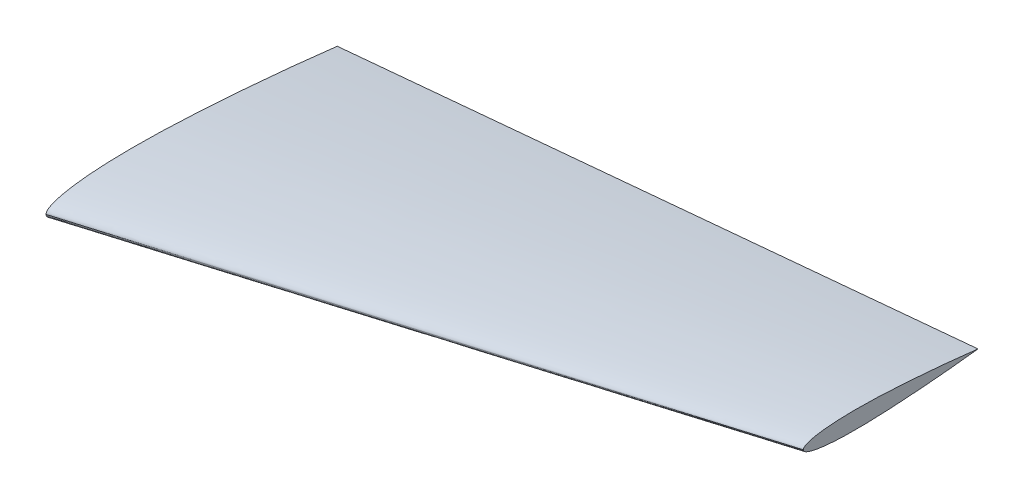
ISO-10303-21;
HEADER;
FILE_DESCRIPTION(('STEP AP214'),'2;1');
FILE_NAME('part.step','',(''),(''),'','','');
FILE_SCHEMA(('AUTOMOTIVE_DESIGN { 1 0 10303 214 1 1 1 1 }'));
ENDSEC;
DATA;
#1=APPLICATION_CONTEXT('core data for automotive mechanical design processes');
#2=APPLICATION_PROTOCOL_DEFINITION('international standard','automotive_design',2000,#1);
#3=PRODUCT_CONTEXT('',#1,'mechanical');
#4=PRODUCT('Part','Part','',(#3));
#5=PRODUCT_RELATED_PRODUCT_CATEGORY('part','',(#4));
#6=PRODUCT_DEFINITION_FORMATION('','',#4);
#7=PRODUCT_DEFINITION_CONTEXT('part definition',#1,'design');
#8=PRODUCT_DEFINITION('design','',#6,#7);
#9=PRODUCT_DEFINITION_SHAPE('','',#8);
#10=(LENGTH_UNIT() NAMED_UNIT(*) SI_UNIT(.MILLI.,.METRE.));
#11=(NAMED_UNIT(*) PLANE_ANGLE_UNIT() SI_UNIT($,.RADIAN.));
#12=(NAMED_UNIT(*) SI_UNIT($,.STERADIAN.) SOLID_ANGLE_UNIT());
#13=UNCERTAINTY_MEASURE_WITH_UNIT(LENGTH_MEASURE(1.E-05),#10,'distance_accuracy_value','');
#14=(GEOMETRIC_REPRESENTATION_CONTEXT(3) GLOBAL_UNCERTAINTY_ASSIGNED_CONTEXT((#13)) GLOBAL_UNIT_ASSIGNED_CONTEXT((#10,
#11,#12)) REPRESENTATION_CONTEXT('',''));
#15=CARTESIAN_POINT('',(0.,0.,0.));
#16=DIRECTION('',(0.,0.,1.));
#17=DIRECTION('',(1.,0.,0.));
#18=AXIS2_PLACEMENT_3D('',#15,#16,#17);
#19=CARTESIAN_POINT('',(0.,-11.0805057677963,126.305662571114));
#20=DIRECTION('',(-1.,0.,0.));
#21=DIRECTION('',(0.,0.,1.));
#22=AXIS2_PLACEMENT_3D('',#19,#20,#21);
#23=PLANE('',#22);
#24=CARTESIAN_POINT('',(0.,8.76924671884693E-13,250.));
#25=CARTESIAN_POINT('',(0.,-0.195763360710238,249.999895280876));
#26=CARTESIAN_POINT('',(0.,-0.603923402419787,249.961151424184));
#27=CARTESIAN_POINT('',(0.,-1.26325094626055,249.759559230242));
#28=CARTESIAN_POINT('',(0.,-2.2398068388507,249.128153902913));
#29=CARTESIAN_POINT('',(0.,-3.17523586217572,248.109823795484));
#30=CARTESIAN_POINT('',(0.,-4.18277314387237,246.576102634747));
#31=CARTESIAN_POINT('',(0.,-5.36669262195682,244.127109162365));
#32=CARTESIAN_POINT('',(0.,-6.81792315426411,240.073872733774));
#33=CARTESIAN_POINT('',(0.,-8.61128849568587,232.840047675853));
#34=CARTESIAN_POINT('',(0.,-10.4496536831648,221.294467729933));
#35=CARTESIAN_POINT('',(0.,-11.8177527202205,205.807713109822));
#36=CARTESIAN_POINT('',(0.,-12.5325051627526,187.492264179643));
#37=CARTESIAN_POINT('',(0.,-12.5623701882674,167.615673922212));
#38=CARTESIAN_POINT('',(0.,-12.1041559417348,147.961305870469));
#39=CARTESIAN_POINT('',(0.,-11.2208810590144,127.983093334777));
#40=CARTESIAN_POINT('',(0.,-10.1073324644267,108.565528946223));
#41=CARTESIAN_POINT('',(0.,-8.64786506361105,88.2724954742038));
#42=CARTESIAN_POINT('',(0.,-7.16412641424022,69.4578073458035));
#43=CARTESIAN_POINT('',(0.,-5.20504048666648,48.2491656867162));
#44=CARTESIAN_POINT('',(0.,-3.5473740497267,31.0441428619004));
#45=CARTESIAN_POINT('',(0.,-1.55880708226586,13.2037628030498));
#46=CARTESIAN_POINT('',(0.,-0.541092362047665,4.46722280332121));
#47=CARTESIAN_POINT('',(0.,9.38157011842053E-13,3.00315328161105E-11));
#48=B_SPLINE_CURVE_WITH_KNOTS('',4,(#24,#25,#26,#27,#28,#29,#30,#31,#32,#33,#34,#35,#36,#37,#38,
#39,#40,#41,#42,#43,#44,#45,#46,#47),.UNSPECIFIED.,.F.,.F.,(5,1,1,1,1,1,1,1,1,1,1,1,1,1,1,1,1,1,
1,1,5),(0.,0.00279140045981441,0.00588271915769683,0.00973465740831716,0.0165224026835013,
0.022438150700394,0.0321580273460902,0.0486342403302747,0.0782486520746178,0.129036717083551,
0.19999701137119,0.270957306932518,0.341917602300949,0.412877898163758,0.483838194434969,
0.554798490760736,0.625758786967488,0.696719083017031,0.767679378971491,0.838639675154267,
0.909599972772417),.UNSPECIFIED.);
#49=CARTESIAN_POINT('',(0.,0.,250.));
#50=VERTEX_POINT('',#49);
#51=CARTESIAN_POINT('',(0.,2.85432870910853E-11,2.35391723989832E-10));
#52=VERTEX_POINT('',#51);
#53=EDGE_CURVE('E57',#50,#52,#48,.T.);
#54=ORIENTED_EDGE('',*,*,#53,.F.);
#55=CARTESIAN_POINT('',(0.,2.85432870910853E-11,2.35391723989832E-10));
#56=CARTESIAN_POINT('',(0.,0.541092362069751,4.46722280347181));
#57=CARTESIAN_POINT('',(0.,1.55880708228551,13.2037628031866));
#58=CARTESIAN_POINT('',(0.,3.54737404973561,31.0441428619501));
#59=CARTESIAN_POINT('',(0.,5.20504048667037,48.2491656867162));
#60=CARTESIAN_POINT('',(0.,7.1641264142438,69.4578073458035));
#61=CARTESIAN_POINT('',(0.,8.64786506361434,88.272495474204));
#62=CARTESIAN_POINT('',(0.,10.1073324644297,108.565528946224));
#63=CARTESIAN_POINT('',(0.,11.2208810590171,127.983093334777));
#64=CARTESIAN_POINT('',(0.,12.1041559417372,147.961305870469));
#65=CARTESIAN_POINT('',(0.,12.5623701882695,167.615673922212));
#66=CARTESIAN_POINT('',(0.,12.5325051627544,187.492264179643));
#67=CARTESIAN_POINT('',(0.,11.817752720222,205.807713109822));
#68=CARTESIAN_POINT('',(0.,10.4496536831661,221.294467729933));
#69=CARTESIAN_POINT('',(0.,8.61128849568701,232.840047675853));
#70=CARTESIAN_POINT('',(0.,6.81792315426514,240.073872733774));
#71=CARTESIAN_POINT('',(0.,5.36669262195778,244.127109162365));
#72=CARTESIAN_POINT('',(0.,4.1827731438733,246.576102634747));
#73=CARTESIAN_POINT('',(0.,3.17523586217662,248.109823795484));
#74=CARTESIAN_POINT('',(0.,2.23980683885159,249.128153902913));
#75=CARTESIAN_POINT('',(0.,1.26325094626144,249.759559230242));
#76=CARTESIAN_POINT('',(0.,0.603923402420665,249.961151424184));
#77=CARTESIAN_POINT('',(0.,0.195763360711115,249.999895280876));
#78=CARTESIAN_POINT('',(0.,0.,250.));
#79=B_SPLINE_CURVE_WITH_KNOTS('',4,(#55,#56,#57,#58,#59,#60,#61,#62,#63,#64,#65,#66,#67,#68,#69,
#70,#71,#72,#73,#74,#75,#76,#77,#78),.UNSPECIFIED.,.F.,.F.,(5,1,1,1,1,1,1,1,1,1,1,1,1,1,1,1,1,1,
1,1,5),(0.,0.0709602976181498,0.141920593800927,0.212880889755386,0.283841185804929,
0.354801482011681,0.425761778337449,0.496722074608659,0.567682370471468,0.638642665839899,
0.709602961401227,0.780563255688866,0.831351320697799,0.860965732442143,0.877441945426327,
0.887161822072023,0.893077570088916,0.8998653153641,0.90371725361472,0.906808572312603,
0.909599972772417),.UNSPECIFIED.);
#80=EDGE_CURVE('E11',#52,#50,#79,.T.);
#81=ORIENTED_EDGE('',*,*,#80,.F.);
#82=EDGE_LOOP('',(#54,#81));
#83=FACE_BOUND('',#82,.T.);
#84=ADVANCED_FACE('F47',(#83),#23,.T.);
#85=CARTESIAN_POINT('',(500.,-6.64830346065999,25.7833975426506));
#86=DIRECTION('',(-1.,0.,0.));
#87=DIRECTION('',(0.,0.,1.));
#88=AXIS2_PLACEMENT_3D('',#85,#86,#87);
#89=PLANE('',#88);
#90=CARTESIAN_POINT('',(500.,1.82902943502338E-11,99.999999999982));
#91=CARTESIAN_POINT('',(500.,-0.117458016408378,99.9999371685073));
#92=CARTESIAN_POINT('',(500.,-0.362354041434108,99.9766908544924));
#93=CARTESIAN_POINT('',(500.,-0.757950567738569,99.855735538127));
#94=CARTESIAN_POINT('',(500.,-1.34388410329266,99.4768923417298));
#95=CARTESIAN_POINT('',(500.,-1.90514151728767,98.8658942772726));
#96=CARTESIAN_POINT('',(500.,-2.50966388630566,97.9456615808301));
#97=CARTESIAN_POINT('',(500.,-3.22001557315633,96.4762654974011));
#98=CARTESIAN_POINT('',(500.,-4.0907538925407,94.0443236402463));
#99=CARTESIAN_POINT('',(500.,-5.16677309739376,89.7040286054937));
#100=CARTESIAN_POINT('',(500.,-6.26979220988112,82.7766806379419));
#101=CARTESIAN_POINT('',(500.,-7.09065163211451,73.4846278658752));
#102=CARTESIAN_POINT('',(500.,-7.51950309763377,62.4953585077676));
#103=CARTESIAN_POINT('',(500.,-7.5374221129427,50.5694043533092));
#104=CARTESIAN_POINT('',(500.,-7.26249356502313,38.7767835222635));
#105=CARTESIAN_POINT('',(500.,-6.73252863539087,26.7898560008479));
#106=CARTESIAN_POINT('',(500.,-6.06439947863829,15.139317367716));
#107=CARTESIAN_POINT('',(500.,-5.18871903814888,2.96349728450425));
#108=CARTESIAN_POINT('',(500.,-4.29847584852638,-8.32531559253594));
#109=CARTESIAN_POINT('',(500.,-3.12302429198214,-21.0505005879883));
#110=CARTESIAN_POINT('',(500.,-2.12842442981827,-31.3735142828778));
#111=CARTESIAN_POINT('',(500.,-0.935284249341771,-42.0777423181882));
#112=CARTESIAN_POINT('',(500.,-0.324655417210853,-47.3196663180253));
#113=CARTESIAN_POINT('',(500.,1.8308664052221E-11,-50.));
#114=B_SPLINE_CURVE_WITH_KNOTS('',4,(#90,#91,#92,#93,#94,#95,#96,#97,#98,#99,#100,#101,#102,
#103,#104,#105,#106,#107,#108,#109,#110,#111,#112,#113),.UNSPECIFIED.,.F.,.F.,(5,1,1,1,1,1,1,1,
1,1,1,1,1,1,1,1,1,1,1,1,5),(0.,0.00279140045981441,0.00588271915769683,0.00973465740831716,
0.0165224026835013,0.022438150700394,0.0321580273460902,0.0486342403302747,0.0782486520746178,
0.129036717083551,0.19999701137119,0.270957306932518,0.341917602300949,0.412877898163758,
0.483838194434969,0.554798490760736,0.625758786967488,0.696719083017031,0.767679378971491,
0.838639675154267,0.909599972772417),.UNSPECIFIED.);
#115=CARTESIAN_POINT('',(500.,1.82902943502338E-11,99.9999999998402));
#116=VERTEX_POINT('',#115);
#117=CARTESIAN_POINT('',(500.,3.79336092472801E-11,-49.9999999999978));
#118=VERTEX_POINT('',#117);
#119=EDGE_CURVE('E79',#116,#118,#114,.T.);
#120=ORIENTED_EDGE('',*,*,#119,.T.);
#121=CARTESIAN_POINT('',(500.,3.79336092472801E-11,-49.9999999999978));
#122=CARTESIAN_POINT('',(500.,0.324655417261916,-47.3196663180615));
#123=CARTESIAN_POINT('',(500.,0.935284249391138,-42.077742318234));
#124=CARTESIAN_POINT('',(500.,2.12842442986014,-31.3735142829848));
#125=CARTESIAN_POINT('',(500.,3.12302429202051,-21.0505005881301));
#126=CARTESIAN_POINT('',(500.,4.29847584856457,-8.32531559267771));
#127=CARTESIAN_POINT('',(500.,5.1887190381869,2.96349728436258));
#128=CARTESIAN_POINT('',(500.,6.06439947867613,15.1393173675744));
#129=CARTESIAN_POINT('',(500.,6.73252863542854,26.7898560007062));
#130=CARTESIAN_POINT('',(500.,7.26249356506061,38.7767835221218));
#131=CARTESIAN_POINT('',(500.,7.53742211298001,50.5694043531676));
#132=CARTESIAN_POINT('',(500.,7.51950309767091,62.495358507626));
#133=CARTESIAN_POINT('',(500.,7.09065163215149,73.4846278657336));
#134=CARTESIAN_POINT('',(500.,6.26979220991796,82.7766806378002));
#135=CARTESIAN_POINT('',(500.,5.16677309743049,89.7040286053519));
#136=CARTESIAN_POINT('',(500.,4.09075389257737,94.0443236401045));
#137=CARTESIAN_POINT('',(500.,3.22001557319296,96.4762654972593));
#138=CARTESIAN_POINT('',(500.,2.50966388634227,97.9456615806883));
#139=CARTESIAN_POINT('',(500.,1.90514151732426,98.8658942771308));
#140=CARTESIAN_POINT('',(500.,1.34388410332925,99.476892341588));
#141=CARTESIAN_POINT('',(500.,0.757950567775152,99.8557355379851));
#142=CARTESIAN_POINT('',(500.,0.362354041470689,99.9766908543506));
#143=CARTESIAN_POINT('',(500.,0.117458016444959,99.9999371683655));
#144=CARTESIAN_POINT('',(500.,1.82902943502338E-11,99.9999999998402));
#145=B_SPLINE_CURVE_WITH_KNOTS('',4,(#121,#122,#123,#124,#125,#126,#127,#128,#129,#130,#131,
#132,#133,#134,#135,#136,#137,#138,#139,#140,#141,#142,#143,#144),.UNSPECIFIED.,.F.,.F.,(5,1,1,
1,1,1,1,1,1,1,1,1,1,1,1,1,1,1,1,1,5),(0.,0.0709602976181498,0.141920593800927,0.212880889755386,
0.283841185804929,0.354801482011681,0.425761778337449,0.496722074608659,0.567682370471468,
0.638642665839899,0.709602961401227,0.780563255688866,0.831351320697799,0.860965732442143,
0.877441945426327,0.887161822072023,0.893077570088916,0.8998653153641,0.90371725361472,
0.906808572312603,0.909599972772417),.UNSPECIFIED.);
#146=EDGE_CURVE('E77',#118,#116,#145,.T.);
#147=ORIENTED_EDGE('',*,*,#146,.T.);
#148=EDGE_LOOP('',(#120,#147));
#149=FACE_BOUND('',#148,.T.);
#150=ADVANCED_FACE('F78',(#149),#89,.F.);
#151=CARTESIAN_POINT('',(500.,1.82902943502338E-11,99.9999999998402));
#152=CARTESIAN_POINT('',(0.,0.,250.));
#153=CARTESIAN_POINT('',(500.,0.117458016444959,99.9999371683655));
#154=CARTESIAN_POINT('',(0.,0.195763360711115,249.999895280876));
#155=CARTESIAN_POINT('',(500.,0.362354041470689,99.9766908543506));
#156=CARTESIAN_POINT('',(0.,0.603923402420665,249.961151424184));
#157=CARTESIAN_POINT('',(500.,0.757950567775152,99.8557355379851));
#158=CARTESIAN_POINT('',(0.,1.26325094626144,249.759559230242));
#159=CARTESIAN_POINT('',(500.,1.34388410332925,99.476892341588));
#160=CARTESIAN_POINT('',(0.,2.23980683885159,249.128153902913));
#161=CARTESIAN_POINT('',(500.,1.90514151732426,98.8658942771308));
#162=CARTESIAN_POINT('',(0.,3.17523586217662,248.109823795484));
#163=CARTESIAN_POINT('',(500.,2.50966388634227,97.9456615806883));
#164=CARTESIAN_POINT('',(0.,4.1827731438733,246.576102634747));
#165=CARTESIAN_POINT('',(500.,3.22001557319296,96.4762654972593));
#166=CARTESIAN_POINT('',(0.,5.36669262195778,244.127109162365));
#167=CARTESIAN_POINT('',(500.,4.09075389257737,94.0443236401045));
#168=CARTESIAN_POINT('',(0.,6.81792315426514,240.073872733774));
#169=CARTESIAN_POINT('',(500.,5.16677309743049,89.7040286053519));
#170=CARTESIAN_POINT('',(0.,8.61128849568701,232.840047675853));
#171=CARTESIAN_POINT('',(500.,6.26979220991796,82.7766806378002));
#172=CARTESIAN_POINT('',(0.,10.4496536831661,221.294467729933));
#173=CARTESIAN_POINT('',(500.,7.09065163215149,73.4846278657336));
#174=CARTESIAN_POINT('',(0.,11.817752720222,205.807713109822));
#175=CARTESIAN_POINT('',(500.,7.51950309767091,62.495358507626));
#176=CARTESIAN_POINT('',(0.,12.5325051627544,187.492264179643));
#177=CARTESIAN_POINT('',(500.,7.53742211298001,50.5694043531676));
#178=CARTESIAN_POINT('',(0.,12.5623701882695,167.615673922212));
#179=CARTESIAN_POINT('',(500.,7.26249356506061,38.7767835221218));
#180=CARTESIAN_POINT('',(0.,12.1041559417372,147.961305870469));
#181=CARTESIAN_POINT('',(500.,6.73252863542854,26.7898560007062));
#182=CARTESIAN_POINT('',(0.,11.2208810590171,127.983093334777));
#183=CARTESIAN_POINT('',(500.,6.06439947867613,15.1393173675744));
#184=CARTESIAN_POINT('',(0.,10.1073324644297,108.565528946224));
#185=CARTESIAN_POINT('',(500.,5.1887190381869,2.96349728436258));
#186=CARTESIAN_POINT('',(0.,8.64786506361434,88.272495474204));
#187=CARTESIAN_POINT('',(500.,4.29847584856457,-8.32531559267771));
#188=CARTESIAN_POINT('',(0.,7.1641264142438,69.4578073458035));
#189=CARTESIAN_POINT('',(500.,3.12302429202051,-21.0505005881301));
#190=CARTESIAN_POINT('',(0.,5.20504048667037,48.2491656867162));
#191=CARTESIAN_POINT('',(500.,2.12842442986014,-31.3735142829848));
#192=CARTESIAN_POINT('',(0.,3.54737404973561,31.0441428619501));
#193=CARTESIAN_POINT('',(500.,0.935284249391138,-42.077742318234));
#194=CARTESIAN_POINT('',(0.,1.55880708228551,13.2037628031866));
#195=CARTESIAN_POINT('',(500.,0.324655417261916,-47.3196663180615));
#196=CARTESIAN_POINT('',(0.,0.541092362069751,4.46722280347181));
#197=CARTESIAN_POINT('',(500.,3.79336092472801E-11,-49.9999999999978));
#198=CARTESIAN_POINT('',(0.,2.85432870910853E-11,2.35391723989832E-10));
#199=B_SPLINE_SURFACE_WITH_KNOTS('',4,1,((#151,#152),(#153,#154),(#155,#156),(#157,#158),(#159,
#160),(#161,#162),(#163,#164),(#165,#166),(#167,#168),(#169,#170),(#171,#172),(#173,#174),(#175,
#176),(#177,#178),(#179,#180),(#181,#182),(#183,#184),(#185,#186),(#187,#188),(#189,#190),(#191,
#192),(#193,#194),(#195,#196),(#197,#198)),.UNSPECIFIED.,.F.,.F.,.F.,(5,1,1,1,1,1,1,1,1,1,1,1,1,
1,1,1,1,1,1,1,5),(2,2),(0.,0.003068822057356,0.00646736954022386,0.0107021302767263,
0.018164471391904,0.0246681523439404,0.0353540328811511,0.0534677240392167,0.0860253456649957,
0.141860950908182,0.219873589883263,0.297886230258619,0.375898870421907,0.453911511128707,
0.531924152284496,0.609936793500264,0.687949434585189,0.765962075497281,0.843974716304839,
0.921987357363406,1.),(0.,1.),.UNSPECIFIED.);
#200=DIRECTION('',(-0.995037190209943,0.,0.0995037190214584));
#201=VECTOR('',#200,1.);
#202=CARTESIAN_POINT('',(250.,3.32384481691827E-11,-24.9999999998812));
#203=LINE('',#202,#201);
#204=EDGE_CURVE('E85',#118,#52,#203,.T.);
#205=DIRECTION('',(0.957826285221067,0.,-0.287347885566626));
#206=VECTOR('',#205,1.);
#207=CARTESIAN_POINT('',(250.,9.1451471751169E-12,174.99999999992));
#208=LINE('',#207,#206);
#209=EDGE_CURVE('E68',#50,#116,#208,.T.);
#210=ORIENTED_EDGE('',*,*,#146,.F.);
#211=ORIENTED_EDGE('',*,*,#204,.T.);
#212=ORIENTED_EDGE('',*,*,#80,.T.);
#213=ORIENTED_EDGE('',*,*,#209,.T.);
#214=EDGE_LOOP('',(#210,#211,#212,#213));
#215=FACE_BOUND('',#214,.T.);
#216=ADVANCED_FACE('F88',(#215),#199,.T.);
#217=CARTESIAN_POINT('',(500.,1.8308664052221E-11,-50.));
#218=CARTESIAN_POINT('',(0.,9.38157011842053E-13,3.00315328161105E-11));
#219=CARTESIAN_POINT('',(500.,-0.324655417210853,-47.3196663180253));
#220=CARTESIAN_POINT('',(0.,-0.541092362047665,4.46722280332121));
#221=CARTESIAN_POINT('',(500.,-0.935284249341771,-42.0777423181882));
#222=CARTESIAN_POINT('',(0.,-1.55880708226586,13.2037628030498));
#223=CARTESIAN_POINT('',(500.,-2.12842442981827,-31.3735142828778));
#224=CARTESIAN_POINT('',(0.,-3.5473740497267,31.0441428619004));
#225=CARTESIAN_POINT('',(500.,-3.12302429198214,-21.0505005879883));
#226=CARTESIAN_POINT('',(0.,-5.20504048666648,48.2491656867162));
#227=CARTESIAN_POINT('',(500.,-4.29847584852638,-8.32531559253594));
#228=CARTESIAN_POINT('',(0.,-7.16412641424022,69.4578073458035));
#229=CARTESIAN_POINT('',(500.,-5.18871903814888,2.96349728450425));
#230=CARTESIAN_POINT('',(0.,-8.64786506361105,88.2724954742038));
#231=CARTESIAN_POINT('',(500.,-6.06439947863829,15.139317367716));
#232=CARTESIAN_POINT('',(0.,-10.1073324644267,108.565528946223));
#233=CARTESIAN_POINT('',(500.,-6.73252863539087,26.7898560008479));
#234=CARTESIAN_POINT('',(0.,-11.2208810590144,127.983093334777));
#235=CARTESIAN_POINT('',(500.,-7.26249356502313,38.7767835222635));
#236=CARTESIAN_POINT('',(0.,-12.1041559417348,147.961305870469));
#237=CARTESIAN_POINT('',(500.,-7.5374221129427,50.5694043533092));
#238=CARTESIAN_POINT('',(0.,-12.5623701882674,167.615673922212));
#239=CARTESIAN_POINT('',(500.,-7.51950309763377,62.4953585077676));
#240=CARTESIAN_POINT('',(0.,-12.5325051627526,187.492264179643));
#241=CARTESIAN_POINT('',(500.,-7.09065163211451,73.4846278658752));
#242=CARTESIAN_POINT('',(0.,-11.8177527202205,205.807713109822));
#243=CARTESIAN_POINT('',(500.,-6.26979220988112,82.7766806379419));
#244=CARTESIAN_POINT('',(0.,-10.4496536831648,221.294467729933));
#245=CARTESIAN_POINT('',(500.,-5.16677309739376,89.7040286054937));
#246=CARTESIAN_POINT('',(0.,-8.61128849568587,232.840047675853));
#247=CARTESIAN_POINT('',(500.,-4.0907538925407,94.0443236402463));
#248=CARTESIAN_POINT('',(0.,-6.81792315426411,240.073872733774));
#249=CARTESIAN_POINT('',(500.,-3.22001557315633,96.4762654974011));
#250=CARTESIAN_POINT('',(0.,-5.36669262195682,244.127109162365));
#251=CARTESIAN_POINT('',(500.,-2.50966388630566,97.9456615808301));
#252=CARTESIAN_POINT('',(0.,-4.18277314387237,246.576102634747));
#253=CARTESIAN_POINT('',(500.,-1.90514151728767,98.8658942772726));
#254=CARTESIAN_POINT('',(0.,-3.17523586217572,248.109823795484));
#255=CARTESIAN_POINT('',(500.,-1.34388410329266,99.4768923417298));
#256=CARTESIAN_POINT('',(0.,-2.2398068388507,249.128153902913));
#257=CARTESIAN_POINT('',(500.,-0.757950567738569,99.855735538127));
#258=CARTESIAN_POINT('',(0.,-1.26325094626055,249.759559230242));
#259=CARTESIAN_POINT('',(500.,-0.362354041434108,99.9766908544924));
#260=CARTESIAN_POINT('',(0.,-0.603923402419787,249.961151424184));
#261=CARTESIAN_POINT('',(500.,-0.117458016408378,99.9999371685073));
#262=CARTESIAN_POINT('',(0.,-0.195763360710238,249.999895280876));
#263=CARTESIAN_POINT('',(500.,1.82902943502338E-11,99.999999999982));
#264=CARTESIAN_POINT('',(0.,8.76924671884693E-13,250.));
#265=B_SPLINE_SURFACE_WITH_KNOTS('',4,1,((#217,#218),(#219,#220),(#221,#222),(#223,#224),(#225,
#226),(#227,#228),(#229,#230),(#231,#232),(#233,#234),(#235,#236),(#237,#238),(#239,#240),(#241,
#242),(#243,#244),(#245,#246),(#247,#248),(#249,#250),(#251,#252),(#253,#254),(#255,#256),(#257,
#258),(#259,#260),(#261,#262),(#263,#264)),.UNSPECIFIED.,.F.,.F.,.F.,(5,1,1,1,1,1,1,1,1,1,1,1,1,
1,1,1,1,1,1,1,5),(2,2),(0.,0.0780126426365936,0.156025283695161,0.234037924502719,
0.312050565414811,0.390063206499736,0.468075847715504,0.546088488871293,0.624101129578093,
0.702113769741381,0.780126410116737,0.858139049091818,0.913974654335004,0.946532275960783,
0.964645967118849,0.97533184765606,0.981835528608096,0.989297869723274,0.993532630459776,
0.996931177942644,1.),(0.,1.),.UNSPECIFIED.);
#266=ORIENTED_EDGE('',*,*,#119,.F.);
#267=ORIENTED_EDGE('',*,*,#209,.F.);
#268=ORIENTED_EDGE('',*,*,#53,.T.);
#269=ORIENTED_EDGE('',*,*,#204,.F.);
#270=EDGE_LOOP('',(#266,#267,#268,#269));
#271=FACE_BOUND('',#270,.T.);
#272=ADVANCED_FACE('F84',(#271),#265,.T.);
#273=CLOSED_SHELL('',(#84,#150,#216,#272));
#274=MANIFOLD_SOLID_BREP('B2',#273);
#275=ADVANCED_BREP_SHAPE_REPRESENTATION('',(#18,#274),#14);
#276=SHAPE_DEFINITION_REPRESENTATION(#9,#275);
ENDSEC;
END-ISO-10303-21;
